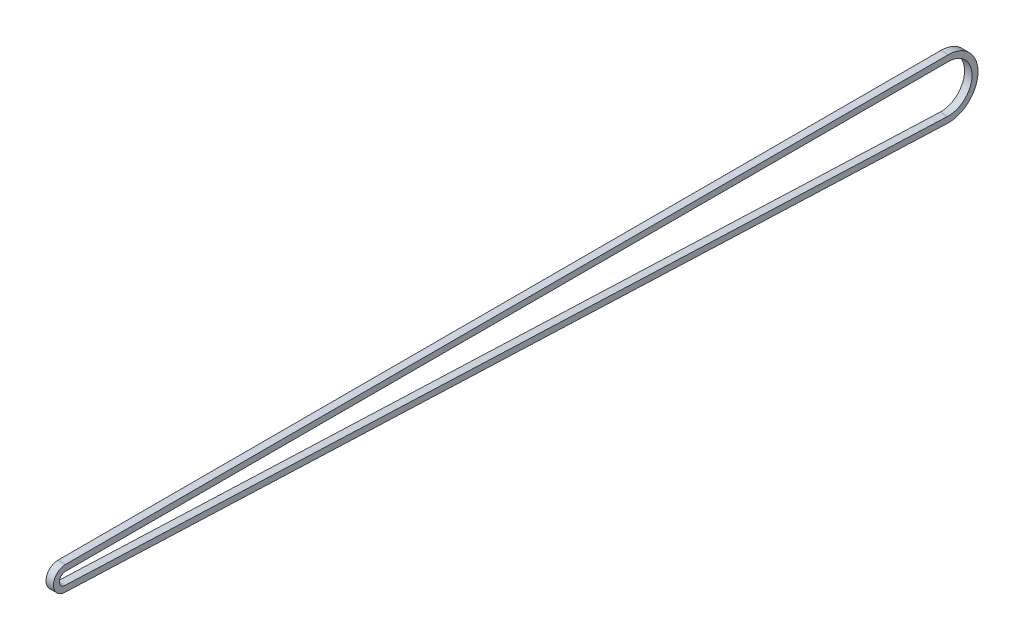
ISO-10303-21;
HEADER;
FILE_DESCRIPTION(('STEP AP214'),'2;1');
FILE_NAME('part.step','',(''),(''),'','','');
FILE_SCHEMA(('AUTOMOTIVE_DESIGN { 1 0 10303 214 1 1 1 1 }'));
ENDSEC;
DATA;
#1=APPLICATION_CONTEXT('core data for automotive mechanical design processes');
#2=APPLICATION_PROTOCOL_DEFINITION('international standard','automotive_design',2000,#1);
#3=PRODUCT_CONTEXT('',#1,'mechanical');
#4=PRODUCT('Part','Part','',(#3));
#5=PRODUCT_RELATED_PRODUCT_CATEGORY('part','',(#4));
#6=PRODUCT_DEFINITION_FORMATION('','',#4);
#7=PRODUCT_DEFINITION_CONTEXT('part definition',#1,'design');
#8=PRODUCT_DEFINITION('design','',#6,#7);
#9=PRODUCT_DEFINITION_SHAPE('','',#8);
#10=(LENGTH_UNIT() NAMED_UNIT(*) SI_UNIT(.MILLI.,.METRE.));
#11=(NAMED_UNIT(*) PLANE_ANGLE_UNIT() SI_UNIT($,.RADIAN.));
#12=(NAMED_UNIT(*) SI_UNIT($,.STERADIAN.) SOLID_ANGLE_UNIT());
#13=UNCERTAINTY_MEASURE_WITH_UNIT(LENGTH_MEASURE(1.E-05),#10,'distance_accuracy_value','');
#14=(GEOMETRIC_REPRESENTATION_CONTEXT(3) GLOBAL_UNCERTAINTY_ASSIGNED_CONTEXT((#13)) GLOBAL_UNIT_ASSIGNED_CONTEXT((#10,
#11,#12)) REPRESENTATION_CONTEXT('',''));
#15=CARTESIAN_POINT('',(0.,0.,0.));
#16=DIRECTION('',(0.,0.,1.));
#17=DIRECTION('',(1.,0.,0.));
#18=AXIS2_PLACEMENT_3D('',#15,#16,#17);
#19=CARTESIAN_POINT('',(5.,-7.99366780060057,0.31823747994489));
#20=DIRECTION('',(0.,0.999208475075071,-0.0397796849931113));
#21=DIRECTION('',(0.,0.0397796849931113,0.999208475075071));
#22=AXIS2_PLACEMENT_3D('',#19,#20,#21);
#23=PLANE('',#22);
#24=DIRECTION('',(0.,-0.0397796849931113,-0.999208475075071));
#25=VECTOR('',#24,1.);
#26=CARTESIAN_POINT('',(0.,-7.99366780060057,0.31823747994489));
#27=LINE('',#26,#25);
#28=CARTESIAN_POINT('',(0.,-7.99366780060057,0.31823747994489));
#29=VERTEX_POINT('',#28);
#30=CARTESIAN_POINT('',(0.,-31.4843673827326,-589.734351221386));
#31=VERTEX_POINT('',#30);
#32=EDGE_CURVE('E143',#29,#31,#27,.T.);
#33=ORIENTED_EDGE('',*,*,#32,.T.);
#34=DIRECTION('',(-1.,0.,0.));
#35=VECTOR('',#34,1.);
#36=CARTESIAN_POINT('',(5.,-31.4843673827326,-589.734351221386));
#37=LINE('',#36,#35);
#38=CARTESIAN_POINT('',(5.,-31.4843673827326,-589.734351221386));
#39=VERTEX_POINT('',#38);
#40=EDGE_CURVE('E11',#39,#31,#37,.T.);
#41=ORIENTED_EDGE('',*,*,#40,.F.);
#42=DIRECTION('',(0.,-0.0397796849931113,-0.999208475075071));
#43=VECTOR('',#42,1.);
#44=CARTESIAN_POINT('',(5.,-7.99366780060057,0.31823747994489));
#45=LINE('',#44,#43);
#46=CARTESIAN_POINT('',(5.,-7.99366780060057,0.31823747994489));
#47=VERTEX_POINT('',#46);
#48=EDGE_CURVE('E114',#47,#39,#45,.T.);
#49=ORIENTED_EDGE('',*,*,#48,.F.);
#50=DIRECTION('',(-1.,0.,0.));
#51=VECTOR('',#50,1.);
#52=CARTESIAN_POINT('',(5.,-7.99366780060057,0.31823747994489));
#53=LINE('',#52,#51);
#54=EDGE_CURVE('E151',#47,#29,#53,.T.);
#55=ORIENTED_EDGE('',*,*,#54,.T.);
#56=EDGE_LOOP('',(#33,#41,#49,#55));
#57=FACE_BOUND('',#56,.T.);
#58=ADVANCED_FACE('F37',(#57),#23,.F.);
#59=CARTESIAN_POINT('',(5.,-11.75,-590.52));
#60=DIRECTION('',(-1.,0.,0.));
#61=DIRECTION('',(0.,0.,1.));
#62=AXIS2_PLACEMENT_3D('',#59,#60,#61);
#63=CYLINDRICAL_SURFACE('',#62,19.75);
#64=CARTESIAN_POINT('',(0.,-11.75,-590.52));
#65=DIRECTION('',(1.,0.,0.));
#66=DIRECTION('',(0.,0.,-1.));
#67=AXIS2_PLACEMENT_3D('',#64,#65,#66);
#68=CIRCLE('',#67,19.75);
#69=CARTESIAN_POINT('',(0.,8.,-590.52));
#70=VERTEX_POINT('',#69);
#71=EDGE_CURVE('E120',#31,#70,#68,.T.);
#72=ORIENTED_EDGE('',*,*,#71,.T.);
#73=DIRECTION('',(-1.,0.,0.));
#74=VECTOR('',#73,1.);
#75=CARTESIAN_POINT('',(5.,8.,-590.52));
#76=LINE('',#75,#74);
#77=CARTESIAN_POINT('',(5.,8.,-590.52));
#78=VERTEX_POINT('',#77);
#79=EDGE_CURVE('E47',#78,#70,#76,.T.);
#80=ORIENTED_EDGE('',*,*,#79,.F.);
#81=CARTESIAN_POINT('',(5.,-11.75,-590.52));
#82=DIRECTION('',(1.,0.,0.));
#83=DIRECTION('',(0.,0.,-1.));
#84=AXIS2_PLACEMENT_3D('',#81,#82,#83);
#85=CIRCLE('',#84,19.75);
#86=EDGE_CURVE('E108',#39,#78,#85,.T.);
#87=ORIENTED_EDGE('',*,*,#86,.F.);
#88=ORIENTED_EDGE('',*,*,#40,.T.);
#89=EDGE_LOOP('',(#72,#80,#87,#88));
#90=FACE_BOUND('',#89,.T.);
#91=ADVANCED_FACE('F119',(#90),#63,.T.);
#92=CARTESIAN_POINT('',(5.,8.,0.));
#93=DIRECTION('',(0.,1.,0.));
#94=DIRECTION('',(0.,0.,1.));
#95=AXIS2_PLACEMENT_3D('',#92,#93,#94);
#96=PLANE('',#95);
#97=DIRECTION('',(0.,0.,-1.));
#98=VECTOR('',#97,1.);
#99=CARTESIAN_POINT('',(0.,8.,0.));
#100=LINE('',#99,#98);
#101=CARTESIAN_POINT('',(0.,8.,0.));
#102=VERTEX_POINT('',#101);
#103=EDGE_CURVE('E147',#102,#70,#100,.T.);
#104=ORIENTED_EDGE('',*,*,#103,.F.);
#105=DIRECTION('',(-1.,0.,0.));
#106=VECTOR('',#105,1.);
#107=CARTESIAN_POINT('',(5.,8.,0.));
#108=LINE('',#107,#106);
#109=CARTESIAN_POINT('',(5.,8.,0.));
#110=VERTEX_POINT('',#109);
#111=EDGE_CURVE('E84',#110,#102,#108,.T.);
#112=ORIENTED_EDGE('',*,*,#111,.F.);
#113=DIRECTION('',(0.,0.,-1.));
#114=VECTOR('',#113,1.);
#115=CARTESIAN_POINT('',(5.,8.,0.));
#116=LINE('',#115,#114);
#117=EDGE_CURVE('E112',#110,#78,#116,.T.);
#118=ORIENTED_EDGE('',*,*,#117,.T.);
#119=ORIENTED_EDGE('',*,*,#79,.T.);
#120=EDGE_LOOP('',(#104,#112,#118,#119));
#121=FACE_BOUND('',#120,.T.);
#122=ADVANCED_FACE('F125',(#121),#96,.T.);
#123=CARTESIAN_POINT('',(5.,0.,0.));
#124=DIRECTION('',(-1.,0.,0.));
#125=DIRECTION('',(0.,0.,1.));
#126=AXIS2_PLACEMENT_3D('',#123,#124,#125);
#127=CYLINDRICAL_SURFACE('',#126,4.);
#128=CARTESIAN_POINT('',(0.,0.,0.));
#129=DIRECTION('',(1.,0.,0.));
#130=DIRECTION('',(0.,0.,-1.));
#131=AXIS2_PLACEMENT_3D('',#128,#129,#130);
#132=CIRCLE('',#131,4.);
#133=CARTESIAN_POINT('',(0.,4.,0.));
#134=VERTEX_POINT('',#133);
#135=CARTESIAN_POINT('',(0.,-3.99683390030028,0.159118739972445));
#136=VERTEX_POINT('',#135);
#137=EDGE_CURVE('E131',#134,#136,#132,.T.);
#138=ORIENTED_EDGE('',*,*,#137,.F.);
#139=DIRECTION('',(-1.,0.,0.));
#140=VECTOR('',#139,1.);
#141=CARTESIAN_POINT('',(5.,4.,0.));
#142=LINE('',#141,#140);
#143=CARTESIAN_POINT('',(5.,4.,0.));
#144=VERTEX_POINT('',#143);
#145=EDGE_CURVE('E41',#144,#134,#142,.T.);
#146=ORIENTED_EDGE('',*,*,#145,.F.);
#147=CARTESIAN_POINT('',(5.,0.,0.));
#148=DIRECTION('',(1.,0.,0.));
#149=DIRECTION('',(0.,0.,-1.));
#150=AXIS2_PLACEMENT_3D('',#147,#148,#149);
#151=CIRCLE('',#150,4.);
#152=CARTESIAN_POINT('',(5.,-3.99683390030028,0.159118739972445));
#153=VERTEX_POINT('',#152);
#154=EDGE_CURVE('E150',#144,#153,#151,.T.);
#155=ORIENTED_EDGE('',*,*,#154,.T.);
#156=DIRECTION('',(-1.,0.,0.));
#157=VECTOR('',#156,1.);
#158=CARTESIAN_POINT('',(5.,-3.99683390030028,0.159118739972445));
#159=LINE('',#158,#157);
#160=EDGE_CURVE('E127',#153,#136,#159,.T.);
#161=ORIENTED_EDGE('',*,*,#160,.T.);
#162=EDGE_LOOP('',(#138,#146,#155,#161));
#163=FACE_BOUND('',#162,.T.);
#164=ADVANCED_FACE('F39',(#163),#127,.F.);
#165=CARTESIAN_POINT('',(5.,4.,0.));
#166=DIRECTION('',(0.,1.,0.));
#167=DIRECTION('',(0.,0.,1.));
#168=AXIS2_PLACEMENT_3D('',#165,#166,#167);
#169=PLANE('',#168);
#170=DIRECTION('',(0.,0.,-1.));
#171=VECTOR('',#170,1.);
#172=CARTESIAN_POINT('',(0.,4.,0.));
#173=LINE('',#172,#171);
#174=CARTESIAN_POINT('',(0.,4.,-590.52));
#175=VERTEX_POINT('',#174);
#176=EDGE_CURVE('E134',#134,#175,#173,.T.);
#177=ORIENTED_EDGE('',*,*,#176,.T.);
#178=DIRECTION('',(-1.,0.,0.));
#179=VECTOR('',#178,1.);
#180=CARTESIAN_POINT('',(5.,4.,-590.52));
#181=LINE('',#180,#179);
#182=CARTESIAN_POINT('',(5.,4.,-590.52));
#183=VERTEX_POINT('',#182);
#184=EDGE_CURVE('E156',#183,#175,#181,.T.);
#185=ORIENTED_EDGE('',*,*,#184,.F.);
#186=DIRECTION('',(0.,0.,-1.));
#187=VECTOR('',#186,1.);
#188=CARTESIAN_POINT('',(5.,4.,0.));
#189=LINE('',#188,#187);
#190=EDGE_CURVE('E164',#144,#183,#189,.T.);
#191=ORIENTED_EDGE('',*,*,#190,.F.);
#192=ORIENTED_EDGE('',*,*,#145,.T.);
#193=EDGE_LOOP('',(#177,#185,#191,#192));
#194=FACE_BOUND('',#193,.T.);
#195=ADVANCED_FACE('F163',(#194),#169,.F.);
#196=CARTESIAN_POINT('',(5.,-11.75,-590.52));
#197=DIRECTION('',(-1.,0.,0.));
#198=DIRECTION('',(0.,0.,1.));
#199=AXIS2_PLACEMENT_3D('',#196,#197,#198);
#200=CYLINDRICAL_SURFACE('',#199,15.7500000000001);
#201=CARTESIAN_POINT('',(0.,-11.75,-590.52));
#202=DIRECTION('',(1.,0.,0.));
#203=DIRECTION('',(0.,0.,-1.));
#204=AXIS2_PLACEMENT_3D('',#201,#202,#203);
#205=CIRCLE('',#204,15.7500000000001);
#206=CARTESIAN_POINT('',(0.,-27.4875334824324,-589.893469961358));
#207=VERTEX_POINT('',#206);
#208=EDGE_CURVE('E137',#207,#175,#205,.T.);
#209=ORIENTED_EDGE('',*,*,#208,.F.);
#210=DIRECTION('',(-1.,0.,0.));
#211=VECTOR('',#210,1.);
#212=CARTESIAN_POINT('',(5.,-27.4875334824324,-589.893469961358));
#213=LINE('',#212,#211);
#214=CARTESIAN_POINT('',(5.,-27.4875334824324,-589.893469961358));
#215=VERTEX_POINT('',#214);
#216=EDGE_CURVE('E155',#215,#207,#213,.T.);
#217=ORIENTED_EDGE('',*,*,#216,.F.);
#218=CARTESIAN_POINT('',(5.,-11.75,-590.52));
#219=DIRECTION('',(1.,0.,0.));
#220=DIRECTION('',(0.,0.,-1.));
#221=AXIS2_PLACEMENT_3D('',#218,#219,#220);
#222=CIRCLE('',#221,15.7500000000001);
#223=EDGE_CURVE('E176',#215,#183,#222,.T.);
#224=ORIENTED_EDGE('',*,*,#223,.T.);
#225=ORIENTED_EDGE('',*,*,#184,.T.);
#226=EDGE_LOOP('',(#209,#217,#224,#225));
#227=FACE_BOUND('',#226,.T.);
#228=ADVANCED_FACE('F174',(#227),#200,.F.);
#229=CARTESIAN_POINT('',(5.,-3.99683390030028,0.159118739972445));
#230=DIRECTION('',(0.,-0.999208475075071,0.0397796849931113));
#231=DIRECTION('',(0.,-0.0397796849931113,-0.999208475075071));
#232=AXIS2_PLACEMENT_3D('',#229,#230,#231);
#233=PLANE('',#232);
#234=DIRECTION('',(0.,0.0397796849931113,0.999208475075071));
#235=VECTOR('',#234,1.);
#236=CARTESIAN_POINT('',(0.,-3.99683390030028,0.159118739972445));
#237=LINE('',#236,#235);
#238=EDGE_CURVE('E140',#207,#136,#237,.T.);
#239=ORIENTED_EDGE('',*,*,#238,.T.);
#240=ORIENTED_EDGE('',*,*,#160,.F.);
#241=DIRECTION('',(0.,0.0397796849931113,0.999208475075071));
#242=VECTOR('',#241,1.);
#243=CARTESIAN_POINT('',(5.,-3.99683390030028,0.159118739972445));
#244=LINE('',#243,#242);
#245=EDGE_CURVE('E177',#215,#153,#244,.T.);
#246=ORIENTED_EDGE('',*,*,#245,.F.);
#247=ORIENTED_EDGE('',*,*,#216,.T.);
#248=EDGE_LOOP('',(#239,#240,#246,#247));
#249=FACE_BOUND('',#248,.T.);
#250=ADVANCED_FACE('F173',(#249),#233,.F.);
#251=CARTESIAN_POINT('',(5.,0.,0.));
#252=DIRECTION('',(-1.,0.,0.));
#253=DIRECTION('',(0.,0.,1.));
#254=AXIS2_PLACEMENT_3D('',#251,#252,#253);
#255=CYLINDRICAL_SURFACE('',#254,8.);
#256=CARTESIAN_POINT('',(0.,0.,0.));
#257=DIRECTION('',(1.,0.,0.));
#258=DIRECTION('',(0.,0.,-1.));
#259=AXIS2_PLACEMENT_3D('',#256,#257,#258);
#260=CIRCLE('',#259,8.);
#261=EDGE_CURVE('E87',#102,#29,#260,.T.);
#262=ORIENTED_EDGE('',*,*,#261,.T.);
#263=ORIENTED_EDGE('',*,*,#54,.F.);
#264=CARTESIAN_POINT('',(5.,0.,0.));
#265=DIRECTION('',(1.,0.,0.));
#266=DIRECTION('',(0.,0.,-1.));
#267=AXIS2_PLACEMENT_3D('',#264,#265,#266);
#268=CIRCLE('',#267,8.);
#269=EDGE_CURVE('E56',#110,#47,#268,.T.);
#270=ORIENTED_EDGE('',*,*,#269,.F.);
#271=ORIENTED_EDGE('',*,*,#111,.T.);
#272=EDGE_LOOP('',(#262,#263,#270,#271));
#273=FACE_BOUND('',#272,.T.);
#274=ADVANCED_FACE('F184',(#273),#255,.T.);
#275=CARTESIAN_POINT('',(5.,0.,0.));
#276=DIRECTION('',(1.,0.,0.));
#277=DIRECTION('',(0.,0.,-1.));
#278=AXIS2_PLACEMENT_3D('',#275,#276,#277);
#279=PLANE('',#278);
#280=ORIENTED_EDGE('',*,*,#154,.F.);
#281=ORIENTED_EDGE('',*,*,#190,.T.);
#282=ORIENTED_EDGE('',*,*,#223,.F.);
#283=ORIENTED_EDGE('',*,*,#245,.T.);
#284=EDGE_LOOP('',(#280,#281,#282,#283));
#285=FACE_BOUND('',#284,.T.);
#286=ORIENTED_EDGE('',*,*,#48,.T.);
#287=ORIENTED_EDGE('',*,*,#86,.T.);
#288=ORIENTED_EDGE('',*,*,#117,.F.);
#289=ORIENTED_EDGE('',*,*,#269,.T.);
#290=EDGE_LOOP('',(#286,#287,#288,#289));
#291=FACE_BOUND('',#290,.T.);
#292=ADVANCED_FACE('F110',(#285,#291),#279,.T.);
#293=CARTESIAN_POINT('',(0.,0.,0.));
#294=DIRECTION('',(1.,0.,0.));
#295=DIRECTION('',(0.,0.,-1.));
#296=AXIS2_PLACEMENT_3D('',#293,#294,#295);
#297=PLANE('',#296);
#298=ORIENTED_EDGE('',*,*,#137,.T.);
#299=ORIENTED_EDGE('',*,*,#238,.F.);
#300=ORIENTED_EDGE('',*,*,#208,.T.);
#301=ORIENTED_EDGE('',*,*,#176,.F.);
#302=EDGE_LOOP('',(#298,#299,#300,#301));
#303=FACE_BOUND('',#302,.T.);
#304=ORIENTED_EDGE('',*,*,#32,.F.);
#305=ORIENTED_EDGE('',*,*,#261,.F.);
#306=ORIENTED_EDGE('',*,*,#103,.T.);
#307=ORIENTED_EDGE('',*,*,#71,.F.);
#308=EDGE_LOOP('',(#304,#305,#306,#307));
#309=FACE_BOUND('',#308,.T.);
#310=ADVANCED_FACE('F167',(#303,#309),#297,.F.);
#311=CLOSED_SHELL('',(#58,#91,#122,#164,#195,#228,#250,#274,#292,#310));
#312=MANIFOLD_SOLID_BREP('B2',#311);
#313=ADVANCED_BREP_SHAPE_REPRESENTATION('',(#18,#312),#14);
#314=SHAPE_DEFINITION_REPRESENTATION(#9,#313);
ENDSEC;
END-ISO-10303-21;
